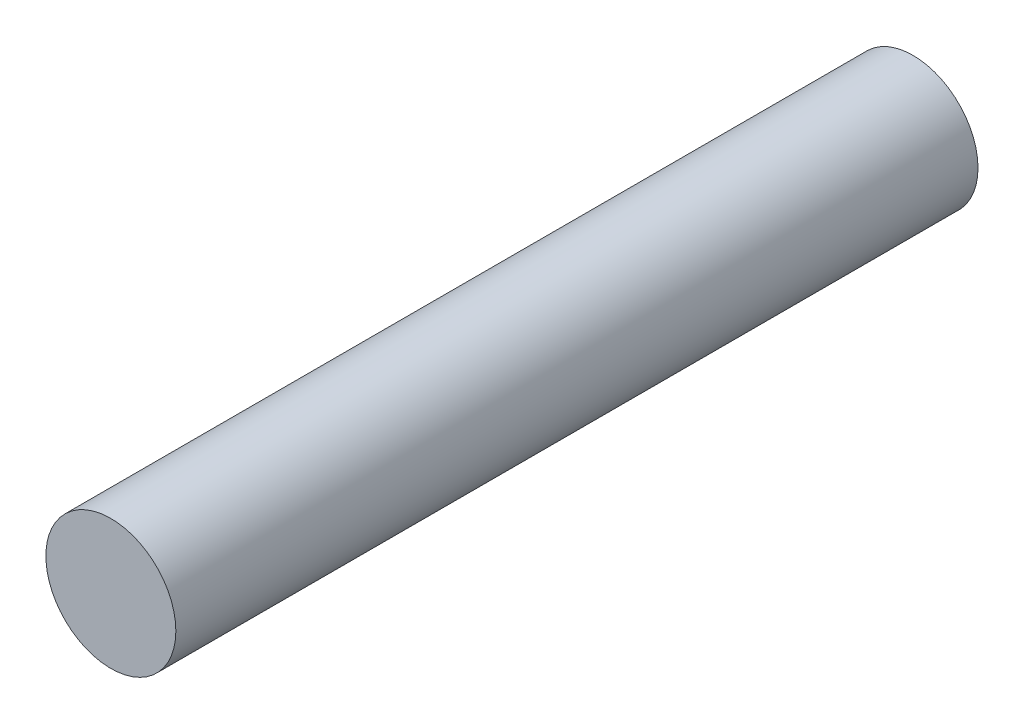
ISO-10303-21;
HEADER;
FILE_DESCRIPTION(('STEP AP214'),'2;1');
FILE_NAME('part.step','',(''),(''),'','','');
FILE_SCHEMA(('AUTOMOTIVE_DESIGN { 1 0 10303 214 1 1 1 1 }'));
ENDSEC;
DATA;
#1=APPLICATION_CONTEXT('core data for automotive mechanical design processes');
#2=APPLICATION_PROTOCOL_DEFINITION('international standard','automotive_design',2000,#1);
#3=PRODUCT_CONTEXT('',#1,'mechanical');
#4=PRODUCT('Part','Part','',(#3));
#5=PRODUCT_RELATED_PRODUCT_CATEGORY('part','',(#4));
#6=PRODUCT_DEFINITION_FORMATION('','',#4);
#7=PRODUCT_DEFINITION_CONTEXT('part definition',#1,'design');
#8=PRODUCT_DEFINITION('design','',#6,#7);
#9=PRODUCT_DEFINITION_SHAPE('','',#8);
#10=(LENGTH_UNIT() NAMED_UNIT(*) SI_UNIT(.MILLI.,.METRE.));
#11=(NAMED_UNIT(*) PLANE_ANGLE_UNIT() SI_UNIT($,.RADIAN.));
#12=(NAMED_UNIT(*) SI_UNIT($,.STERADIAN.) SOLID_ANGLE_UNIT());
#13=UNCERTAINTY_MEASURE_WITH_UNIT(LENGTH_MEASURE(1.E-05),#10,'distance_accuracy_value','');
#14=(GEOMETRIC_REPRESENTATION_CONTEXT(3) GLOBAL_UNCERTAINTY_ASSIGNED_CONTEXT((#13)) GLOBAL_UNIT_ASSIGNED_CONTEXT((#10,
#11,#12)) REPRESENTATION_CONTEXT('',''));
#15=CARTESIAN_POINT('',(0.,0.,0.));
#16=DIRECTION('',(0.,0.,1.));
#17=DIRECTION('',(1.,0.,0.));
#18=AXIS2_PLACEMENT_3D('',#15,#16,#17);
#19=CARTESIAN_POINT('',(0.,0.,2.16));
#20=DIRECTION('',(0.,0.,-1.));
#21=DIRECTION('',(-1.,0.,0.));
#22=AXIS2_PLACEMENT_3D('',#19,#20,#21);
#23=CYLINDRICAL_SURFACE('',#22,0.175);
#24=CARTESIAN_POINT('',(0.,0.,2.16));
#25=DIRECTION('',(0.,0.,1.));
#26=DIRECTION('',(1.,0.,0.));
#27=AXIS2_PLACEMENT_3D('',#24,#25,#26);
#28=CIRCLE('',#27,0.175);
#29=CARTESIAN_POINT('',(0.175,0.,2.16));
#30=VERTEX_POINT('',#29);
#31=EDGE_CURVE('E10',#30,#30,#28,.T.);
#32=ORIENTED_EDGE('',*,*,#31,.F.);
#33=EDGE_LOOP('',(#32));
#34=FACE_BOUND('',#33,.T.);
#35=CARTESIAN_POINT('',(0.,0.,0.));
#36=DIRECTION('',(0.,0.,1.));
#37=DIRECTION('',(1.,0.,0.));
#38=AXIS2_PLACEMENT_3D('',#35,#36,#37);
#39=CIRCLE('',#38,0.175);
#40=CARTESIAN_POINT('',(0.175,0.,0.));
#41=VERTEX_POINT('',#40);
#42=EDGE_CURVE('E33',#41,#41,#39,.T.);
#43=ORIENTED_EDGE('',*,*,#42,.T.);
#44=EDGE_LOOP('',(#43));
#45=FACE_BOUND('',#44,.T.);
#46=ADVANCED_FACE('F30',(#34,#45),#23,.T.);
#47=CARTESIAN_POINT('',(0.,0.,2.16));
#48=DIRECTION('',(0.,0.,1.));
#49=DIRECTION('',(1.,0.,0.));
#50=AXIS2_PLACEMENT_3D('',#47,#48,#49);
#51=PLANE('',#50);
#52=ORIENTED_EDGE('',*,*,#31,.T.);
#53=EDGE_LOOP('',(#52));
#54=FACE_BOUND('',#53,.T.);
#55=ADVANCED_FACE('F45',(#54),#51,.T.);
#56=CARTESIAN_POINT('',(0.,0.,0.));
#57=DIRECTION('',(0.,0.,1.));
#58=DIRECTION('',(1.,0.,0.));
#59=AXIS2_PLACEMENT_3D('',#56,#57,#58);
#60=PLANE('',#59);
#61=ORIENTED_EDGE('',*,*,#42,.F.);
#62=EDGE_LOOP('',(#61));
#63=FACE_BOUND('',#62,.T.);
#64=ADVANCED_FACE('F43',(#63),#60,.F.);
#65=CLOSED_SHELL('',(#46,#55,#64));
#66=MANIFOLD_SOLID_BREP('B2',#65);
#67=ADVANCED_BREP_SHAPE_REPRESENTATION('',(#18,#66),#14);
#68=SHAPE_DEFINITION_REPRESENTATION(#9,#67);
ENDSEC;
END-ISO-10303-21;
